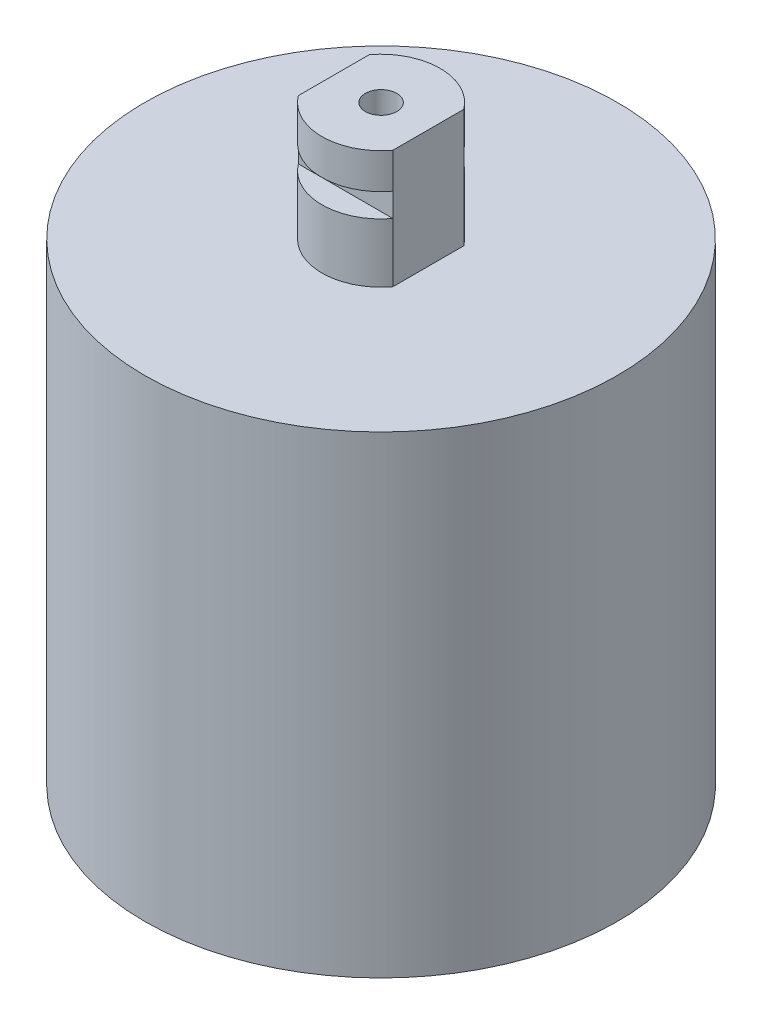
ISO-10303-21;
HEADER;
FILE_DESCRIPTION(('STEP AP214'),'2;1');
FILE_NAME('part.step','',(''),(''),'','','');
FILE_SCHEMA(('AUTOMOTIVE_DESIGN { 1 0 10303 214 1 1 1 1 }'));
ENDSEC;
DATA;
#1=APPLICATION_CONTEXT('core data for automotive mechanical design processes');
#2=APPLICATION_PROTOCOL_DEFINITION('international standard','automotive_design',2000,#1);
#3=PRODUCT_CONTEXT('',#1,'mechanical');
#4=PRODUCT('Part','Part','',(#3));
#5=PRODUCT_RELATED_PRODUCT_CATEGORY('part','',(#4));
#6=PRODUCT_DEFINITION_FORMATION('','',#4);
#7=PRODUCT_DEFINITION_CONTEXT('part definition',#1,'design');
#8=PRODUCT_DEFINITION('design','',#6,#7);
#9=PRODUCT_DEFINITION_SHAPE('','',#8);
#10=(LENGTH_UNIT() NAMED_UNIT(*) SI_UNIT(.MILLI.,.METRE.));
#11=(NAMED_UNIT(*) PLANE_ANGLE_UNIT() SI_UNIT($,.RADIAN.));
#12=(NAMED_UNIT(*) SI_UNIT($,.STERADIAN.) SOLID_ANGLE_UNIT());
#13=UNCERTAINTY_MEASURE_WITH_UNIT(LENGTH_MEASURE(1.E-05),#10,'distance_accuracy_value','');
#14=(GEOMETRIC_REPRESENTATION_CONTEXT(3) GLOBAL_UNCERTAINTY_ASSIGNED_CONTEXT((#13)) GLOBAL_UNIT_ASSIGNED_CONTEXT((#10,
#11,#12)) REPRESENTATION_CONTEXT('',''));
#15=CARTESIAN_POINT('',(0.,0.,0.));
#16=DIRECTION('',(0.,0.,1.));
#17=DIRECTION('',(1.,0.,0.));
#18=AXIS2_PLACEMENT_3D('',#15,#16,#17);
#19=CARTESIAN_POINT('',(0.,30.,0.));
#20=DIRECTION('',(0.,-1.,0.));
#21=DIRECTION('',(0.,0.,-1.));
#22=AXIS2_PLACEMENT_3D('',#19,#20,#21);
#23=CYLINDRICAL_SURFACE('',#22,15.);
#24=CARTESIAN_POINT('',(0.,21.,0.));
#25=DIRECTION('',(0.,-1.,0.));
#26=DIRECTION('',(0.,0.,-1.));
#27=AXIS2_PLACEMENT_3D('',#24,#25,#26);
#28=CIRCLE('',#27,15.);
#29=CARTESIAN_POINT('',(12.,21.,-9.00000000000001));
#30=VERTEX_POINT('',#29);
#31=CARTESIAN_POINT('',(-12.,21.,-9.00000000000001));
#32=VERTEX_POINT('',#31);
#33=EDGE_CURVE('E110',#30,#32,#28,.F.);
#34=ORIENTED_EDGE('',*,*,#33,.T.);
#35=DIRECTION('',(0.,-1.,0.));
#36=VECTOR('',#35,1.);
#37=CARTESIAN_POINT('',(-12.,30.,-9.00000000000001));
#38=LINE('',#37,#36);
#39=CARTESIAN_POINT('',(-12.,30.,-9.00000000000001));
#40=VERTEX_POINT('',#39);
#41=EDGE_CURVE('E113',#40,#32,#38,.T.);
#42=ORIENTED_EDGE('',*,*,#41,.F.);
#43=CARTESIAN_POINT('',(0.,30.,0.));
#44=DIRECTION('',(0.,1.,0.));
#45=DIRECTION('',(0.,0.,1.));
#46=AXIS2_PLACEMENT_3D('',#43,#44,#45);
#47=CIRCLE('',#46,15.);
#48=CARTESIAN_POINT('',(12.,30.,-9.00000000000001));
#49=VERTEX_POINT('',#48);
#50=EDGE_CURVE('E166',#49,#40,#47,.T.);
#51=ORIENTED_EDGE('',*,*,#50,.F.);
#52=DIRECTION('',(0.,-1.,0.));
#53=VECTOR('',#52,1.);
#54=CARTESIAN_POINT('',(12.,30.,-9.00000000000001));
#55=LINE('',#54,#53);
#56=EDGE_CURVE('E115',#49,#30,#55,.T.);
#57=ORIENTED_EDGE('',*,*,#56,.T.);
#58=EDGE_LOOP('',(#34,#42,#51,#57));
#59=FACE_BOUND('',#58,.T.);
#60=ADVANCED_FACE('F41',(#59),#23,.T.);
#61=CARTESIAN_POINT('',(0.,15.,0.));
#62=DIRECTION('',(0.,1.,0.));
#63=DIRECTION('',(0.,0.,1.));
#64=AXIS2_PLACEMENT_3D('',#61,#62,#63);
#65=CIRCLE('',#64,15.);
#66=CARTESIAN_POINT('',(-12.,15.,-9.00000000000001));
#67=VERTEX_POINT('',#66);
#68=CARTESIAN_POINT('',(12.,15.,-9.00000000000001));
#69=VERTEX_POINT('',#68);
#70=EDGE_CURVE('E120',#67,#69,#65,.F.);
#71=ORIENTED_EDGE('',*,*,#70,.T.);
#72=CARTESIAN_POINT('',(12.,0.,-9.00000000000001));
#73=VERTEX_POINT('',#72);
#74=EDGE_CURVE('E161',#69,#73,#55,.T.);
#75=ORIENTED_EDGE('',*,*,#74,.T.);
#76=CARTESIAN_POINT('',(0.,0.,0.));
#77=DIRECTION('',(0.,1.,0.));
#78=DIRECTION('',(0.,0.,1.));
#79=AXIS2_PLACEMENT_3D('',#76,#77,#78);
#80=CIRCLE('',#79,15.);
#81=CARTESIAN_POINT('',(-12.,0.,-9.00000000000001));
#82=VERTEX_POINT('',#81);
#83=EDGE_CURVE('E174',#73,#82,#80,.T.);
#84=ORIENTED_EDGE('',*,*,#83,.T.);
#85=EDGE_CURVE('E143',#67,#82,#38,.T.);
#86=ORIENTED_EDGE('',*,*,#85,.F.);
#87=EDGE_LOOP('',(#71,#75,#84,#86));
#88=FACE_BOUND('',#87,.T.);
#89=ADVANCED_FACE('F241',(#88),#23,.T.);
#90=CARTESIAN_POINT('',(0.,30.,0.));
#91=DIRECTION('',(0.,-1.,0.));
#92=DIRECTION('',(0.,0.,-1.));
#93=AXIS2_PLACEMENT_3D('',#90,#91,#92);
#94=CYLINDRICAL_SURFACE('',#93,15.);
#95=DIRECTION('',(0.,-1.,0.));
#96=VECTOR('',#95,1.);
#97=CARTESIAN_POINT('',(12.,30.,9.00000000000001));
#98=LINE('',#97,#96);
#99=CARTESIAN_POINT('',(12.,15.,9.00000000000001));
#100=VERTEX_POINT('',#99);
#101=CARTESIAN_POINT('',(12.,0.,9.00000000000001));
#102=VERTEX_POINT('',#101);
#103=EDGE_CURVE('E158',#100,#102,#98,.T.);
#104=ORIENTED_EDGE('',*,*,#103,.F.);
#105=CARTESIAN_POINT('',(0.,15.,0.));
#106=DIRECTION('',(0.,-1.,0.));
#107=DIRECTION('',(0.,0.,-1.));
#108=AXIS2_PLACEMENT_3D('',#105,#106,#107);
#109=CIRCLE('',#108,15.);
#110=CARTESIAN_POINT('',(-12.,15.,9.00000000000001));
#111=VERTEX_POINT('',#110);
#112=EDGE_CURVE('E196',#111,#100,#109,.F.);
#113=ORIENTED_EDGE('',*,*,#112,.F.);
#114=DIRECTION('',(0.,-1.,0.));
#115=VECTOR('',#114,1.);
#116=CARTESIAN_POINT('',(-12.,30.,9.00000000000001));
#117=LINE('',#116,#115);
#118=CARTESIAN_POINT('',(-12.,0.,9.00000000000001));
#119=VERTEX_POINT('',#118);
#120=EDGE_CURVE('E153',#111,#119,#117,.T.);
#121=ORIENTED_EDGE('',*,*,#120,.T.);
#122=CARTESIAN_POINT('',(0.,0.,0.));
#123=DIRECTION('',(0.,1.,0.));
#124=DIRECTION('',(0.,0.,1.));
#125=AXIS2_PLACEMENT_3D('',#122,#123,#124);
#126=CIRCLE('',#125,15.);
#127=EDGE_CURVE('E167',#119,#102,#126,.T.);
#128=ORIENTED_EDGE('',*,*,#127,.T.);
#129=EDGE_LOOP('',(#104,#113,#121,#128));
#130=FACE_BOUND('',#129,.T.);
#131=ADVANCED_FACE('F252',(#130),#94,.T.);
#132=CARTESIAN_POINT('',(0.,-120.,0.));
#133=DIRECTION('',(0.,1.,0.));
#134=DIRECTION('',(0.,0.,1.));
#135=AXIS2_PLACEMENT_3D('',#132,#133,#134);
#136=CYLINDRICAL_SURFACE('',#135,60.);
#137=CARTESIAN_POINT('',(0.,-120.,0.));
#138=DIRECTION('',(0.,1.,0.));
#139=DIRECTION('',(0.,0.,1.));
#140=AXIS2_PLACEMENT_3D('',#137,#138,#139);
#141=CIRCLE('',#140,60.);
#142=CARTESIAN_POINT('',(0.,-120.,60.));
#143=VERTEX_POINT('',#142);
#144=EDGE_CURVE('E11',#143,#143,#141,.T.);
#145=ORIENTED_EDGE('',*,*,#144,.T.);
#146=EDGE_LOOP('',(#145));
#147=FACE_BOUND('',#146,.T.);
#148=CARTESIAN_POINT('',(0.,0.,0.));
#149=DIRECTION('',(0.,1.,0.));
#150=DIRECTION('',(0.,0.,1.));
#151=AXIS2_PLACEMENT_3D('',#148,#149,#150);
#152=CIRCLE('',#151,60.);
#153=CARTESIAN_POINT('',(0.,0.,60.));
#154=VERTEX_POINT('',#153);
#155=EDGE_CURVE('E45',#154,#154,#152,.T.);
#156=ORIENTED_EDGE('',*,*,#155,.F.);
#157=EDGE_LOOP('',(#156));
#158=FACE_BOUND('',#157,.T.);
#159=ADVANCED_FACE('F43',(#147,#158),#136,.T.);
#160=CARTESIAN_POINT('',(0.,-120.,0.));
#161=DIRECTION('',(0.,1.,0.));
#162=DIRECTION('',(0.,0.,1.));
#163=AXIS2_PLACEMENT_3D('',#160,#161,#162);
#164=PLANE('',#163);
#165=ORIENTED_EDGE('',*,*,#144,.F.);
#166=EDGE_LOOP('',(#165));
#167=FACE_BOUND('',#166,.T.);
#168=ADVANCED_FACE('F283',(#167),#164,.F.);
#169=CARTESIAN_POINT('',(0.,0.,0.));
#170=DIRECTION('',(0.,1.,0.));
#171=DIRECTION('',(0.,0.,1.));
#172=AXIS2_PLACEMENT_3D('',#169,#170,#171);
#173=PLANE('',#172);
#174=ORIENTED_EDGE('',*,*,#83,.F.);
#175=DIRECTION('',(0.,0.,-1.));
#176=VECTOR('',#175,1.);
#177=CARTESIAN_POINT('',(12.,0.,9.00000000000001));
#178=LINE('',#177,#176);
#179=EDGE_CURVE('E162',#102,#73,#178,.T.);
#180=ORIENTED_EDGE('',*,*,#179,.F.);
#181=ORIENTED_EDGE('',*,*,#127,.F.);
#182=DIRECTION('',(0.,0.,1.));
#183=VECTOR('',#182,1.);
#184=CARTESIAN_POINT('',(-12.,0.,-9.00000000000001));
#185=LINE('',#184,#183);
#186=EDGE_CURVE('E171',#82,#119,#185,.T.);
#187=ORIENTED_EDGE('',*,*,#186,.F.);
#188=EDGE_LOOP('',(#174,#180,#181,#187));
#189=FACE_BOUND('',#188,.T.);
#190=ORIENTED_EDGE('',*,*,#155,.T.);
#191=EDGE_LOOP('',(#190));
#192=FACE_BOUND('',#191,.T.);
#193=ADVANCED_FACE('F247',(#189,#192),#173,.T.);
#194=CARTESIAN_POINT('',(-12.,30.,-9.00000000000001));
#195=DIRECTION('',(1.,0.,0.));
#196=DIRECTION('',(0.,0.,-1.));
#197=AXIS2_PLACEMENT_3D('',#194,#195,#196);
#198=PLANE('',#197);
#199=ORIENTED_EDGE('',*,*,#186,.T.);
#200=ORIENTED_EDGE('',*,*,#120,.F.);
#201=DIRECTION('',(0.,-1.,0.));
#202=VECTOR('',#201,1.);
#203=CARTESIAN_POINT('',(-12.,30.,9.00000000000001));
#204=LINE('',#203,#202);
#205=CARTESIAN_POINT('',(-12.,21.,9.00000000000001));
#206=VERTEX_POINT('',#205);
#207=EDGE_CURVE('E135',#206,#111,#204,.T.);
#208=ORIENTED_EDGE('',*,*,#207,.F.);
#209=CARTESIAN_POINT('',(-12.,30.,9.00000000000001));
#210=VERTEX_POINT('',#209);
#211=EDGE_CURVE('E148',#210,#206,#117,.T.);
#212=ORIENTED_EDGE('',*,*,#211,.F.);
#213=DIRECTION('',(0.,0.,1.));
#214=VECTOR('',#213,1.);
#215=CARTESIAN_POINT('',(-12.,30.,-9.00000000000001));
#216=LINE('',#215,#214);
#217=EDGE_CURVE('E140',#40,#210,#216,.T.);
#218=ORIENTED_EDGE('',*,*,#217,.F.);
#219=ORIENTED_EDGE('',*,*,#41,.T.);
#220=DIRECTION('',(0.,-1.,0.));
#221=VECTOR('',#220,1.);
#222=CARTESIAN_POINT('',(-12.,30.,-9.00000000000001));
#223=LINE('',#222,#221);
#224=EDGE_CURVE('E124',#32,#67,#223,.T.);
#225=ORIENTED_EDGE('',*,*,#224,.T.);
#226=ORIENTED_EDGE('',*,*,#85,.T.);
#227=EDGE_LOOP('',(#199,#200,#208,#212,#218,#219,#225,#226));
#228=FACE_BOUND('',#227,.T.);
#229=ADVANCED_FACE('F138',(#228),#198,.F.);
#230=ORIENTED_EDGE('',*,*,#211,.T.);
#231=CARTESIAN_POINT('',(0.,21.,0.));
#232=DIRECTION('',(0.,1.,0.));
#233=DIRECTION('',(0.,0.,1.));
#234=AXIS2_PLACEMENT_3D('',#231,#232,#233);
#235=CIRCLE('',#234,15.);
#236=CARTESIAN_POINT('',(12.,21.,9.00000000000001));
#237=VERTEX_POINT('',#236);
#238=EDGE_CURVE('E199',#237,#206,#235,.F.);
#239=ORIENTED_EDGE('',*,*,#238,.F.);
#240=CARTESIAN_POINT('',(12.,30.,9.00000000000001));
#241=VERTEX_POINT('',#240);
#242=EDGE_CURVE('E154',#241,#237,#98,.T.);
#243=ORIENTED_EDGE('',*,*,#242,.F.);
#244=CARTESIAN_POINT('',(0.,30.,0.));
#245=DIRECTION('',(0.,1.,0.));
#246=DIRECTION('',(0.,0.,1.));
#247=AXIS2_PLACEMENT_3D('',#244,#245,#246);
#248=CIRCLE('',#247,15.);
#249=EDGE_CURVE('E181',#210,#241,#248,.T.);
#250=ORIENTED_EDGE('',*,*,#249,.F.);
#251=EDGE_LOOP('',(#230,#239,#243,#250));
#252=FACE_BOUND('',#251,.T.);
#253=ADVANCED_FACE('F261',(#252),#94,.T.);
#254=CARTESIAN_POINT('',(12.,30.,9.00000000000001));
#255=DIRECTION('',(-1.,0.,0.));
#256=DIRECTION('',(0.,0.,1.));
#257=AXIS2_PLACEMENT_3D('',#254,#255,#256);
#258=PLANE('',#257);
#259=ORIENTED_EDGE('',*,*,#179,.T.);
#260=ORIENTED_EDGE('',*,*,#74,.F.);
#261=DIRECTION('',(0.,1.,0.));
#262=VECTOR('',#261,1.);
#263=CARTESIAN_POINT('',(12.,15.,-9.00000000000001));
#264=LINE('',#263,#262);
#265=EDGE_CURVE('E119',#69,#30,#264,.T.);
#266=ORIENTED_EDGE('',*,*,#265,.T.);
#267=ORIENTED_EDGE('',*,*,#56,.F.);
#268=DIRECTION('',(0.,0.,-1.));
#269=VECTOR('',#268,1.);
#270=CARTESIAN_POINT('',(12.,30.,9.00000000000001));
#271=LINE('',#270,#269);
#272=EDGE_CURVE('E178',#241,#49,#271,.T.);
#273=ORIENTED_EDGE('',*,*,#272,.F.);
#274=ORIENTED_EDGE('',*,*,#242,.T.);
#275=DIRECTION('',(0.,1.,0.));
#276=VECTOR('',#275,1.);
#277=CARTESIAN_POINT('',(12.,15.,9.00000000000001));
#278=LINE('',#277,#276);
#279=EDGE_CURVE('E191',#100,#237,#278,.T.);
#280=ORIENTED_EDGE('',*,*,#279,.F.);
#281=ORIENTED_EDGE('',*,*,#103,.T.);
#282=EDGE_LOOP('',(#259,#260,#266,#267,#273,#274,#280,#281));
#283=FACE_BOUND('',#282,.T.);
#284=ADVANCED_FACE('F232',(#283),#258,.F.);
#285=CARTESIAN_POINT('',(0.,30.,0.));
#286=DIRECTION('',(0.,1.,0.));
#287=DIRECTION('',(0.,0.,1.));
#288=AXIS2_PLACEMENT_3D('',#285,#286,#287);
#289=PLANE('',#288);
#290=CARTESIAN_POINT('',(0.,30.,0.));
#291=DIRECTION('',(0.,1.,0.));
#292=DIRECTION('',(0.,0.,1.));
#293=AXIS2_PLACEMENT_3D('',#290,#291,#292);
#294=CIRCLE('',#293,4.);
#295=CARTESIAN_POINT('',(0.,30.,4.));
#296=VERTEX_POINT('',#295);
#297=EDGE_CURVE('E211',#296,#296,#294,.T.);
#298=ORIENTED_EDGE('',*,*,#297,.F.);
#299=EDGE_LOOP('',(#298));
#300=FACE_BOUND('',#299,.T.);
#301=ORIENTED_EDGE('',*,*,#50,.T.);
#302=ORIENTED_EDGE('',*,*,#217,.T.);
#303=ORIENTED_EDGE('',*,*,#249,.T.);
#304=ORIENTED_EDGE('',*,*,#272,.T.);
#305=EDGE_LOOP('',(#301,#302,#303,#304));
#306=FACE_BOUND('',#305,.T.);
#307=ADVANCED_FACE('F228',(#300,#306),#289,.T.);
#308=CARTESIAN_POINT('',(-60.001,15.,9.00000000000001));
#309=DIRECTION('',(0.,0.,-1.));
#310=DIRECTION('',(-1.,0.,0.));
#311=AXIS2_PLACEMENT_3D('',#308,#309,#310);
#312=PLANE('',#311);
#313=ORIENTED_EDGE('',*,*,#207,.T.);
#314=DIRECTION('',(1.,0.,0.));
#315=VECTOR('',#314,1.);
#316=CARTESIAN_POINT('',(-60.001,15.,9.00000000000001));
#317=LINE('',#316,#315);
#318=EDGE_CURVE('E65',#111,#100,#317,.T.);
#319=ORIENTED_EDGE('',*,*,#318,.T.);
#320=ORIENTED_EDGE('',*,*,#279,.T.);
#321=DIRECTION('',(1.,0.,0.));
#322=VECTOR('',#321,1.);
#323=CARTESIAN_POINT('',(-60.001,21.,9.00000000000001));
#324=LINE('',#323,#322);
#325=EDGE_CURVE('E188',#206,#237,#324,.T.);
#326=ORIENTED_EDGE('',*,*,#325,.F.);
#327=EDGE_LOOP('',(#313,#319,#320,#326));
#328=FACE_BOUND('',#327,.T.);
#329=ADVANCED_FACE('F231',(#328),#312,.F.);
#330=CARTESIAN_POINT('',(-60.001,15.,9.00000000000001));
#331=DIRECTION('',(0.,-1.,0.));
#332=DIRECTION('',(0.,0.,-1.));
#333=AXIS2_PLACEMENT_3D('',#330,#331,#332);
#334=PLANE('',#333);
#335=ORIENTED_EDGE('',*,*,#112,.T.);
#336=ORIENTED_EDGE('',*,*,#318,.F.);
#337=EDGE_LOOP('',(#335,#336));
#338=FACE_BOUND('',#337,.T.);
#339=ADVANCED_FACE('F265',(#338),#334,.F.);
#340=CARTESIAN_POINT('',(-60.001,21.,9.00000000000001));
#341=DIRECTION('',(0.,1.,0.));
#342=DIRECTION('',(0.,0.,1.));
#343=AXIS2_PLACEMENT_3D('',#340,#341,#342);
#344=PLANE('',#343);
#345=ORIENTED_EDGE('',*,*,#238,.T.);
#346=ORIENTED_EDGE('',*,*,#325,.T.);
#347=EDGE_LOOP('',(#345,#346));
#348=FACE_BOUND('',#347,.T.);
#349=ADVANCED_FACE('F263',(#348),#344,.F.);
#350=CARTESIAN_POINT('',(-60.001,15.,-9.00000000000001));
#351=DIRECTION('',(0.,0.,-1.));
#352=DIRECTION('',(-1.,0.,0.));
#353=AXIS2_PLACEMENT_3D('',#350,#351,#352);
#354=PLANE('',#353);
#355=DIRECTION('',(1.,0.,0.));
#356=VECTOR('',#355,1.);
#357=CARTESIAN_POINT('',(-60.001,21.,-9.00000000000001));
#358=LINE('',#357,#356);
#359=EDGE_CURVE('E57',#32,#30,#358,.T.);
#360=ORIENTED_EDGE('',*,*,#359,.T.);
#361=ORIENTED_EDGE('',*,*,#265,.F.);
#362=DIRECTION('',(1.,0.,0.));
#363=VECTOR('',#362,1.);
#364=CARTESIAN_POINT('',(-60.001,15.,-9.00000000000001));
#365=LINE('',#364,#363);
#366=EDGE_CURVE('E127',#67,#69,#365,.T.);
#367=ORIENTED_EDGE('',*,*,#366,.F.);
#368=ORIENTED_EDGE('',*,*,#224,.F.);
#369=EDGE_LOOP('',(#360,#361,#367,#368));
#370=FACE_BOUND('',#369,.T.);
#371=ADVANCED_FACE('F125',(#370),#354,.T.);
#372=CARTESIAN_POINT('',(-60.001,21.,-9.00000000000001));
#373=DIRECTION('',(0.,-1.,0.));
#374=DIRECTION('',(0.,0.,-1.));
#375=AXIS2_PLACEMENT_3D('',#372,#373,#374);
#376=PLANE('',#375);
#377=ORIENTED_EDGE('',*,*,#33,.F.);
#378=ORIENTED_EDGE('',*,*,#359,.F.);
#379=EDGE_LOOP('',(#377,#378));
#380=FACE_BOUND('',#379,.T.);
#381=ADVANCED_FACE('F133',(#380),#376,.T.);
#382=CARTESIAN_POINT('',(-60.001,15.,-9.00000000000001));
#383=DIRECTION('',(0.,1.,0.));
#384=DIRECTION('',(0.,0.,1.));
#385=AXIS2_PLACEMENT_3D('',#382,#383,#384);
#386=PLANE('',#385);
#387=ORIENTED_EDGE('',*,*,#366,.T.);
#388=ORIENTED_EDGE('',*,*,#70,.F.);
#389=EDGE_LOOP('',(#387,#388));
#390=FACE_BOUND('',#389,.T.);
#391=ADVANCED_FACE('F224',(#390),#386,.T.);
#392=CARTESIAN_POINT('',(0.,0.,0.));
#393=DIRECTION('',(0.,1.,0.));
#394=DIRECTION('',(0.,0.,1.));
#395=AXIS2_PLACEMENT_3D('',#392,#393,#394);
#396=CYLINDRICAL_SURFACE('',#395,4.);
#397=CARTESIAN_POINT('',(0.,0.,0.));
#398=DIRECTION('',(0.,1.,0.));
#399=DIRECTION('',(0.,0.,1.));
#400=AXIS2_PLACEMENT_3D('',#397,#398,#399);
#401=CIRCLE('',#400,4.);
#402=CARTESIAN_POINT('',(0.,0.,4.));
#403=VERTEX_POINT('',#402);
#404=EDGE_CURVE('E131',#403,#403,#401,.T.);
#405=ORIENTED_EDGE('',*,*,#404,.F.);
#406=EDGE_LOOP('',(#405));
#407=FACE_BOUND('',#406,.T.);
#408=ORIENTED_EDGE('',*,*,#297,.T.);
#409=EDGE_LOOP('',(#408));
#410=FACE_BOUND('',#409,.T.);
#411=ADVANCED_FACE('F221',(#407,#410),#396,.F.);
#412=CARTESIAN_POINT('',(0.,0.,0.));
#413=DIRECTION('',(0.,1.,0.));
#414=DIRECTION('',(0.,0.,1.));
#415=AXIS2_PLACEMENT_3D('',#412,#413,#414);
#416=PLANE('',#415);
#417=ORIENTED_EDGE('',*,*,#404,.T.);
#418=EDGE_LOOP('',(#417));
#419=FACE_BOUND('',#418,.T.);
#420=ADVANCED_FACE('F219',(#419),#416,.T.);
#421=CLOSED_SHELL('',(#60,#89,#131,#159,#168,#193,#229,#253,#284,#307,#329,#339,#349,#371,#381,
#391,#411,#420));
#422=MANIFOLD_SOLID_BREP('B2',#421);
#423=ADVANCED_BREP_SHAPE_REPRESENTATION('',(#18,#422),#14);
#424=SHAPE_DEFINITION_REPRESENTATION(#9,#423);
ENDSEC;
END-ISO-10303-21;
